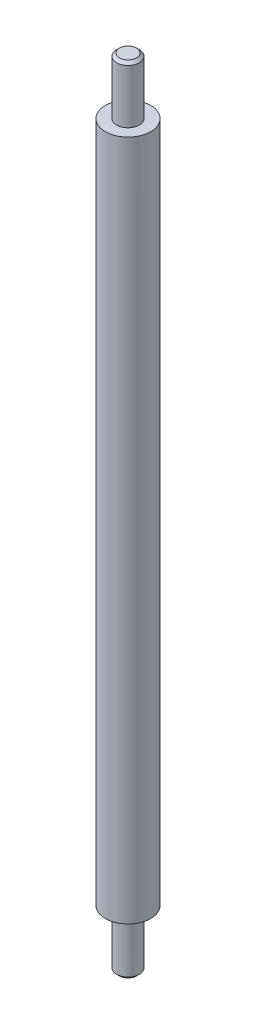
ISO-10303-21;
HEADER;
FILE_DESCRIPTION(('STEP AP214'),'2;1');
FILE_NAME('part.step','',(''),(''),'','','');
FILE_SCHEMA(('AUTOMOTIVE_DESIGN { 1 0 10303 214 1 1 1 1 }'));
ENDSEC;
DATA;
#1=APPLICATION_CONTEXT('core data for automotive mechanical design processes');
#2=APPLICATION_PROTOCOL_DEFINITION('international standard','automotive_design',2000,#1);
#3=PRODUCT_CONTEXT('',#1,'mechanical');
#4=PRODUCT('Part','Part','',(#3));
#5=PRODUCT_RELATED_PRODUCT_CATEGORY('part','',(#4));
#6=PRODUCT_DEFINITION_FORMATION('','',#4);
#7=PRODUCT_DEFINITION_CONTEXT('part definition',#1,'design');
#8=PRODUCT_DEFINITION('design','',#6,#7);
#9=PRODUCT_DEFINITION_SHAPE('','',#8);
#10=(LENGTH_UNIT() NAMED_UNIT(*) SI_UNIT(.MILLI.,.METRE.));
#11=(NAMED_UNIT(*) PLANE_ANGLE_UNIT() SI_UNIT($,.RADIAN.));
#12=(NAMED_UNIT(*) SI_UNIT($,.STERADIAN.) SOLID_ANGLE_UNIT());
#13=UNCERTAINTY_MEASURE_WITH_UNIT(LENGTH_MEASURE(1.E-05),#10,'distance_accuracy_value','');
#14=(GEOMETRIC_REPRESENTATION_CONTEXT(3) GLOBAL_UNCERTAINTY_ASSIGNED_CONTEXT((#13)) GLOBAL_UNIT_ASSIGNED_CONTEXT((#10,
#11,#12)) REPRESENTATION_CONTEXT('',''));
#15=CARTESIAN_POINT('',(0.,0.,0.));
#16=DIRECTION('',(0.,0.,1.));
#17=DIRECTION('',(1.,0.,0.));
#18=AXIS2_PLACEMENT_3D('',#15,#16,#17);
#19=CARTESIAN_POINT('',(0.,140.,0.));
#20=DIRECTION('',(0.,-1.,0.));
#21=DIRECTION('',(0.,0.,-1.));
#22=AXIS2_PLACEMENT_3D('',#19,#20,#21);
#23=CYLINDRICAL_SURFACE('',#22,4.);
#24=CARTESIAN_POINT('',(0.,130.,0.));
#25=DIRECTION('',(0.,1.,0.));
#26=DIRECTION('',(0.,0.,1.));
#27=AXIS2_PLACEMENT_3D('',#24,#25,#26);
#28=CIRCLE('',#27,4.);
#29=CARTESIAN_POINT('',(0.,130.,4.));
#30=VERTEX_POINT('',#29);
#31=EDGE_CURVE('E57',#30,#30,#28,.T.);
#32=ORIENTED_EDGE('',*,*,#31,.F.);
#33=EDGE_LOOP('',(#32));
#34=FACE_BOUND('',#33,.T.);
#35=CARTESIAN_POINT('',(0.,10.,0.));
#36=DIRECTION('',(0.,-1.,0.));
#37=DIRECTION('',(0.,0.,-1.));
#38=AXIS2_PLACEMENT_3D('',#35,#36,#37);
#39=CIRCLE('',#38,4.);
#40=CARTESIAN_POINT('',(0.,10.,-4.));
#41=VERTEX_POINT('',#40);
#42=EDGE_CURVE('E63',#41,#41,#39,.T.);
#43=ORIENTED_EDGE('',*,*,#42,.F.);
#44=EDGE_LOOP('',(#43));
#45=FACE_BOUND('',#44,.T.);
#46=ADVANCED_FACE('F37',(#34,#45),#23,.T.);
#47=CARTESIAN_POINT('',(0.,130.,0.));
#48=DIRECTION('',(0.,1.,0.));
#49=DIRECTION('',(0.,0.,1.));
#50=AXIS2_PLACEMENT_3D('',#47,#48,#49);
#51=CYLINDRICAL_SURFACE('',#50,2.);
#52=CARTESIAN_POINT('',(0.,139.5,0.));
#53=DIRECTION('',(0.,1.,0.));
#54=DIRECTION('',(0.,0.,1.));
#55=AXIS2_PLACEMENT_3D('',#52,#53,#54);
#56=CIRCLE('',#55,2.);
#57=CARTESIAN_POINT('',(0.,139.5,2.));
#58=VERTEX_POINT('',#57);
#59=EDGE_CURVE('E48',#58,#58,#56,.F.);
#60=ORIENTED_EDGE('',*,*,#59,.T.);
#61=EDGE_LOOP('',(#60));
#62=FACE_BOUND('',#61,.T.);
#63=CARTESIAN_POINT('',(0.,130.,0.));
#64=DIRECTION('',(0.,1.,0.));
#65=DIRECTION('',(0.,0.,1.));
#66=AXIS2_PLACEMENT_3D('',#63,#64,#65);
#67=CIRCLE('',#66,2.);
#68=CARTESIAN_POINT('',(0.,130.,2.));
#69=VERTEX_POINT('',#68);
#70=EDGE_CURVE('E60',#69,#69,#67,.T.);
#71=ORIENTED_EDGE('',*,*,#70,.T.);
#72=EDGE_LOOP('',(#71));
#73=FACE_BOUND('',#72,.T.);
#74=ADVANCED_FACE('F80',(#62,#73),#51,.T.);
#75=CARTESIAN_POINT('',(0.,130.,0.));
#76=DIRECTION('',(0.,1.,0.));
#77=DIRECTION('',(0.,0.,1.));
#78=AXIS2_PLACEMENT_3D('',#75,#76,#77);
#79=PLANE('',#78);
#80=ORIENTED_EDGE('',*,*,#70,.F.);
#81=EDGE_LOOP('',(#80));
#82=FACE_BOUND('',#81,.T.);
#83=ORIENTED_EDGE('',*,*,#31,.T.);
#84=EDGE_LOOP('',(#83));
#85=FACE_BOUND('',#84,.T.);
#86=ADVANCED_FACE('F86',(#82,#85),#79,.T.);
#87=CARTESIAN_POINT('',(0.,140.,0.));
#88=DIRECTION('',(0.,1.,0.));
#89=DIRECTION('',(0.,0.,1.));
#90=AXIS2_PLACEMENT_3D('',#87,#88,#89);
#91=PLANE('',#90);
#92=CARTESIAN_POINT('',(0.,140.,0.));
#93=DIRECTION('',(0.,1.,0.));
#94=DIRECTION('',(0.,0.,1.));
#95=AXIS2_PLACEMENT_3D('',#92,#93,#94);
#96=CIRCLE('',#95,1.50000000000002);
#97=CARTESIAN_POINT('',(0.,140.,1.50000000000002));
#98=VERTEX_POINT('',#97);
#99=EDGE_CURVE('E52',#98,#98,#96,.T.);
#100=ORIENTED_EDGE('',*,*,#99,.T.);
#101=EDGE_LOOP('',(#100));
#102=FACE_BOUND('',#101,.T.);
#103=ADVANCED_FACE('F75',(#102),#91,.T.);
#104=CARTESIAN_POINT('',(0.,10.,0.));
#105=DIRECTION('',(0.,-1.,0.));
#106=DIRECTION('',(0.,0.,-1.));
#107=AXIS2_PLACEMENT_3D('',#104,#105,#106);
#108=PLANE('',#107);
#109=CARTESIAN_POINT('',(0.,10.,0.));
#110=DIRECTION('',(0.,-1.,0.));
#111=DIRECTION('',(0.,0.,-1.));
#112=AXIS2_PLACEMENT_3D('',#109,#110,#111);
#113=CIRCLE('',#112,2.);
#114=CARTESIAN_POINT('',(0.,10.,-2.));
#115=VERTEX_POINT('',#114);
#116=EDGE_CURVE('E66',#115,#115,#113,.T.);
#117=ORIENTED_EDGE('',*,*,#116,.F.);
#118=EDGE_LOOP('',(#117));
#119=FACE_BOUND('',#118,.T.);
#120=ORIENTED_EDGE('',*,*,#42,.T.);
#121=EDGE_LOOP('',(#120));
#122=FACE_BOUND('',#121,.T.);
#123=ADVANCED_FACE('F72',(#119,#122),#108,.T.);
#124=CARTESIAN_POINT('',(0.,10.,0.));
#125=DIRECTION('',(0.,-1.,0.));
#126=DIRECTION('',(0.,0.,-1.));
#127=AXIS2_PLACEMENT_3D('',#124,#125,#126);
#128=CYLINDRICAL_SURFACE('',#127,2.);
#129=CARTESIAN_POINT('',(0.,0.500000000000006,0.));
#130=DIRECTION('',(0.,1.,0.));
#131=DIRECTION('',(0.,0.,1.));
#132=AXIS2_PLACEMENT_3D('',#129,#130,#131);
#133=CIRCLE('',#132,2.);
#134=CARTESIAN_POINT('',(0.,0.500000000000006,2.));
#135=VERTEX_POINT('',#134);
#136=EDGE_CURVE('E10',#135,#135,#133,.T.);
#137=ORIENTED_EDGE('',*,*,#136,.T.);
#138=EDGE_LOOP('',(#137));
#139=FACE_BOUND('',#138,.T.);
#140=ORIENTED_EDGE('',*,*,#116,.T.);
#141=EDGE_LOOP('',(#140));
#142=FACE_BOUND('',#141,.T.);
#143=ADVANCED_FACE('F70',(#139,#142),#128,.T.);
#144=CARTESIAN_POINT('',(0.,0.,0.));
#145=DIRECTION('',(0.,1.,0.));
#146=DIRECTION('',(0.,0.,1.));
#147=AXIS2_PLACEMENT_3D('',#144,#145,#146);
#148=PLANE('',#147);
#149=CARTESIAN_POINT('',(0.,0.,0.));
#150=DIRECTION('',(0.,1.,0.));
#151=DIRECTION('',(0.,0.,1.));
#152=AXIS2_PLACEMENT_3D('',#149,#150,#151);
#153=CIRCLE('',#152,1.49999999999999);
#154=CARTESIAN_POINT('',(0.,0.,1.49999999999999));
#155=VERTEX_POINT('',#154);
#156=EDGE_CURVE('E44',#155,#155,#153,.F.);
#157=ORIENTED_EDGE('',*,*,#156,.T.);
#158=EDGE_LOOP('',(#157));
#159=FACE_BOUND('',#158,.T.);
#160=ADVANCED_FACE('F91',(#159),#148,.F.);
#161=CARTESIAN_POINT('',(0.,140.,0.));
#162=DIRECTION('',(0.,-1.,0.));
#163=DIRECTION('',(0.,0.,-1.));
#164=AXIS2_PLACEMENT_3D('',#161,#162,#163);
#165=CONICAL_SURFACE('',#164,1.50000000000002,0.785398163397433);
#166=ORIENTED_EDGE('',*,*,#59,.F.);
#167=EDGE_LOOP('',(#166));
#168=FACE_BOUND('',#167,.T.);
#169=ORIENTED_EDGE('',*,*,#99,.F.);
#170=EDGE_LOOP('',(#169));
#171=FACE_BOUND('',#170,.T.);
#172=ADVANCED_FACE('F93',(#168,#171),#165,.T.);
#173=CARTESIAN_POINT('',(0.,0.,0.));
#174=DIRECTION('',(0.,1.,0.));
#175=DIRECTION('',(0.,0.,1.));
#176=AXIS2_PLACEMENT_3D('',#173,#174,#175);
#177=CONICAL_SURFACE('',#176,1.49999999999999,0.785398163397455);
#178=ORIENTED_EDGE('',*,*,#136,.F.);
#179=EDGE_LOOP('',(#178));
#180=FACE_BOUND('',#179,.T.);
#181=ORIENTED_EDGE('',*,*,#156,.F.);
#182=EDGE_LOOP('',(#181));
#183=FACE_BOUND('',#182,.T.);
#184=ADVANCED_FACE('F39',(#180,#183),#177,.T.);
#185=CLOSED_SHELL('',(#46,#74,#86,#103,#123,#143,#160,#172,#184));
#186=MANIFOLD_SOLID_BREP('B2',#185);
#187=ADVANCED_BREP_SHAPE_REPRESENTATION('',(#18,#186),#14);
#188=SHAPE_DEFINITION_REPRESENTATION(#9,#187);
ENDSEC;
END-ISO-10303-21;
